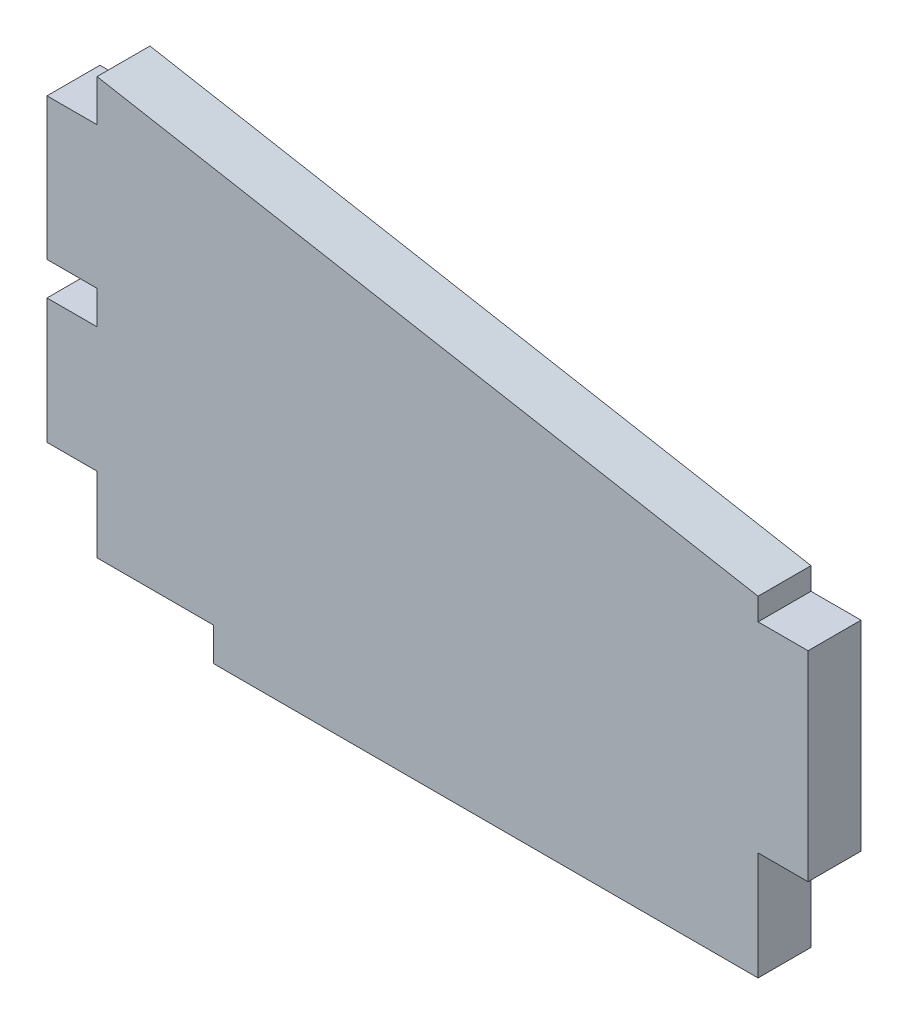
ISO-10303-21;
HEADER;
FILE_DESCRIPTION(('STEP AP214'),'2;1');
FILE_NAME('part.step','',(''),(''),'','','');
FILE_SCHEMA(('AUTOMOTIVE_DESIGN { 1 0 10303 214 1 1 1 1 }'));
ENDSEC;
DATA;
#1=APPLICATION_CONTEXT('core data for automotive mechanical design processes');
#2=APPLICATION_PROTOCOL_DEFINITION('international standard','automotive_design',2000,#1);
#3=PRODUCT_CONTEXT('',#1,'mechanical');
#4=PRODUCT('Part','Part','',(#3));
#5=PRODUCT_RELATED_PRODUCT_CATEGORY('part','',(#4));
#6=PRODUCT_DEFINITION_FORMATION('','',#4);
#7=PRODUCT_DEFINITION_CONTEXT('part definition',#1,'design');
#8=PRODUCT_DEFINITION('design','',#6,#7);
#9=PRODUCT_DEFINITION_SHAPE('','',#8);
#10=(LENGTH_UNIT() NAMED_UNIT(*) SI_UNIT(.MILLI.,.METRE.));
#11=(NAMED_UNIT(*) PLANE_ANGLE_UNIT() SI_UNIT($,.RADIAN.));
#12=(NAMED_UNIT(*) SI_UNIT($,.STERADIAN.) SOLID_ANGLE_UNIT());
#13=UNCERTAINTY_MEASURE_WITH_UNIT(LENGTH_MEASURE(1.E-05),#10,'distance_accuracy_value','');
#14=(GEOMETRIC_REPRESENTATION_CONTEXT(3) GLOBAL_UNCERTAINTY_ASSIGNED_CONTEXT((#13)) GLOBAL_UNIT_ASSIGNED_CONTEXT((#10,
#11,#12)) REPRESENTATION_CONTEXT('',''));
#15=CARTESIAN_POINT('',(0.,0.,0.));
#16=DIRECTION('',(0.,0.,1.));
#17=DIRECTION('',(1.,0.,0.));
#18=AXIS2_PLACEMENT_3D('',#15,#16,#17);
#19=CARTESIAN_POINT('',(-22.825,0.,3.175));
#20=DIRECTION('',(-1.,0.,0.));
#21=DIRECTION('',(0.,0.,1.));
#22=AXIS2_PLACEMENT_3D('',#19,#20,#21);
#23=PLANE('',#22);
#24=DIRECTION('',(0.,1.,0.));
#25=VECTOR('',#24,1.);
#26=CARTESIAN_POINT('',(-22.825,0.,0.));
#27=LINE('',#26,#25);
#28=CARTESIAN_POINT('',(-22.825,1.5,0.));
#29=VERTEX_POINT('',#28);
#30=CARTESIAN_POINT('',(-22.825,9.99999999999999,0.));
#31=VERTEX_POINT('',#30);
#32=EDGE_CURVE('E270',#29,#31,#27,.T.);
#33=ORIENTED_EDGE('',*,*,#32,.F.);
#34=DIRECTION('',(0.,0.,1.));
#35=VECTOR('',#34,1.);
#36=CARTESIAN_POINT('',(-22.825,1.5,0.));
#37=LINE('',#36,#35);
#38=CARTESIAN_POINT('',(-22.825,1.5,3.175));
#39=VERTEX_POINT('',#38);
#40=EDGE_CURVE('E197',#29,#39,#37,.T.);
#41=ORIENTED_EDGE('',*,*,#40,.T.);
#42=DIRECTION('',(0.,1.,0.));
#43=VECTOR('',#42,1.);
#44=CARTESIAN_POINT('',(-22.825,0.,3.175));
#45=LINE('',#44,#43);
#46=CARTESIAN_POINT('',(-22.825,9.99999999999999,3.175));
#47=VERTEX_POINT('',#46);
#48=EDGE_CURVE('E241',#39,#47,#45,.T.);
#49=ORIENTED_EDGE('',*,*,#48,.T.);
#50=DIRECTION('',(0.,0.,-1.));
#51=VECTOR('',#50,1.);
#52=CARTESIAN_POINT('',(-22.825,9.99999999999999,3.175));
#53=LINE('',#52,#51);
#54=EDGE_CURVE('E280',#47,#31,#53,.T.);
#55=ORIENTED_EDGE('',*,*,#54,.T.);
#56=EDGE_LOOP('',(#33,#41,#49,#55));
#57=FACE_BOUND('',#56,.T.);
#58=ADVANCED_FACE('F39',(#57),#23,.T.);
#59=CARTESIAN_POINT('',(0.,-12.5,3.175));
#60=DIRECTION('',(0.,1.,0.));
#61=DIRECTION('',(0.,0.,1.));
#62=AXIS2_PLACEMENT_3D('',#59,#60,#61);
#63=PLANE('',#62);
#64=DIRECTION('',(1.,0.,0.));
#65=VECTOR('',#64,1.);
#66=CARTESIAN_POINT('',(0.,-12.5,0.));
#67=LINE('',#66,#65);
#68=CARTESIAN_POINT('',(-19.825,-12.5,0.));
#69=VERTEX_POINT('',#68);
#70=CARTESIAN_POINT('',(-12.825,-12.5,0.));
#71=VERTEX_POINT('',#70);
#72=EDGE_CURVE('E206',#69,#71,#67,.T.);
#73=ORIENTED_EDGE('',*,*,#72,.T.);
#74=DIRECTION('',(0.,0.,1.));
#75=VECTOR('',#74,1.);
#76=CARTESIAN_POINT('',(-12.825,-12.5,-32.7111983883196));
#77=LINE('',#76,#75);
#78=CARTESIAN_POINT('',(-12.825,-12.5,3.175));
#79=VERTEX_POINT('',#78);
#80=EDGE_CURVE('E211',#71,#79,#77,.T.);
#81=ORIENTED_EDGE('',*,*,#80,.T.);
#82=DIRECTION('',(1.,0.,0.));
#83=VECTOR('',#82,1.);
#84=CARTESIAN_POINT('',(0.,-12.5,3.175));
#85=LINE('',#84,#83);
#86=CARTESIAN_POINT('',(-19.825,-12.5,3.175));
#87=VERTEX_POINT('',#86);
#88=EDGE_CURVE('E217',#87,#79,#85,.T.);
#89=ORIENTED_EDGE('',*,*,#88,.F.);
#90=DIRECTION('',(0.,0.,-1.));
#91=VECTOR('',#90,1.);
#92=CARTESIAN_POINT('',(-19.825,-12.5,3.175));
#93=LINE('',#92,#91);
#94=EDGE_CURVE('E274',#87,#69,#93,.T.);
#95=ORIENTED_EDGE('',*,*,#94,.T.);
#96=EDGE_LOOP('',(#73,#81,#89,#95));
#97=FACE_BOUND('',#96,.T.);
#98=ADVANCED_FACE('F41',(#97),#63,.F.);
#99=CARTESIAN_POINT('',(19.825,0.,3.175));
#100=DIRECTION('',(-1.,0.,0.));
#101=DIRECTION('',(0.,0.,1.));
#102=AXIS2_PLACEMENT_3D('',#99,#100,#101);
#103=PLANE('',#102);
#104=DIRECTION('',(0.,1.,0.));
#105=VECTOR('',#104,1.);
#106=CARTESIAN_POINT('',(19.825,0.,0.));
#107=LINE('',#106,#105);
#108=CARTESIAN_POINT('',(19.825,-14.5,0.));
#109=VERTEX_POINT('',#108);
#110=CARTESIAN_POINT('',(19.825,-8.,0.));
#111=VERTEX_POINT('',#110);
#112=EDGE_CURVE('E250',#109,#111,#107,.T.);
#113=ORIENTED_EDGE('',*,*,#112,.T.);
#114=DIRECTION('',(0.,0.,-1.));
#115=VECTOR('',#114,1.);
#116=CARTESIAN_POINT('',(19.825,-8.,3.175));
#117=LINE('',#116,#115);
#118=CARTESIAN_POINT('',(19.825,-8.,3.175));
#119=VERTEX_POINT('',#118);
#120=EDGE_CURVE('E11',#119,#111,#117,.T.);
#121=ORIENTED_EDGE('',*,*,#120,.F.);
#122=DIRECTION('',(0.,1.,0.));
#123=VECTOR('',#122,1.);
#124=CARTESIAN_POINT('',(19.825,0.,3.175));
#125=LINE('',#124,#123);
#126=CARTESIAN_POINT('',(19.825,-14.5,3.175));
#127=VERTEX_POINT('',#126);
#128=EDGE_CURVE('E220',#127,#119,#125,.T.);
#129=ORIENTED_EDGE('',*,*,#128,.F.);
#130=DIRECTION('',(0.,0.,1.));
#131=VECTOR('',#130,1.);
#132=CARTESIAN_POINT('',(19.825,-14.5,-32.7111983883196));
#133=LINE('',#132,#131);
#134=EDGE_CURVE('E204',#109,#127,#133,.T.);
#135=ORIENTED_EDGE('',*,*,#134,.F.);
#136=EDGE_LOOP('',(#113,#121,#129,#135));
#137=FACE_BOUND('',#136,.T.);
#138=ADVANCED_FACE('F316',(#137),#103,.F.);
#139=CARTESIAN_POINT('',(0.,-7.99999999999999,3.175));
#140=DIRECTION('',(0.,1.,0.));
#141=DIRECTION('',(-1.,0.,0.));
#142=AXIS2_PLACEMENT_3D('',#139,#140,#141);
#143=PLANE('',#142);
#144=DIRECTION('',(1.,0.,0.));
#145=VECTOR('',#144,1.);
#146=CARTESIAN_POINT('',(0.,-7.99999999999999,0.));
#147=LINE('',#146,#145);
#148=CARTESIAN_POINT('',(22.825,-8.,0.));
#149=VERTEX_POINT('',#148);
#150=EDGE_CURVE('E252',#111,#149,#147,.T.);
#151=ORIENTED_EDGE('',*,*,#150,.T.);
#152=DIRECTION('',(0.,0.,-1.));
#153=VECTOR('',#152,1.);
#154=CARTESIAN_POINT('',(22.825,-8.,3.175));
#155=LINE('',#154,#153);
#156=CARTESIAN_POINT('',(22.825,-8.,3.175));
#157=VERTEX_POINT('',#156);
#158=EDGE_CURVE('E47',#157,#149,#155,.T.);
#159=ORIENTED_EDGE('',*,*,#158,.F.);
#160=DIRECTION('',(1.,0.,0.));
#161=VECTOR('',#160,1.);
#162=CARTESIAN_POINT('',(0.,-7.99999999999999,3.175));
#163=LINE('',#162,#161);
#164=EDGE_CURVE('E223',#119,#157,#163,.T.);
#165=ORIENTED_EDGE('',*,*,#164,.F.);
#166=ORIENTED_EDGE('',*,*,#120,.T.);
#167=EDGE_LOOP('',(#151,#159,#165,#166));
#168=FACE_BOUND('',#167,.T.);
#169=ADVANCED_FACE('F314',(#168),#143,.F.);
#170=CARTESIAN_POINT('',(22.825,0.,3.175));
#171=DIRECTION('',(-1.,0.,0.));
#172=DIRECTION('',(0.,0.,1.));
#173=AXIS2_PLACEMENT_3D('',#170,#171,#172);
#174=PLANE('',#173);
#175=DIRECTION('',(0.,1.,0.));
#176=VECTOR('',#175,1.);
#177=CARTESIAN_POINT('',(22.825,0.,0.));
#178=LINE('',#177,#176);
#179=CARTESIAN_POINT('',(22.825,4.,0.));
#180=VERTEX_POINT('',#179);
#181=EDGE_CURVE('E255',#149,#180,#178,.T.);
#182=ORIENTED_EDGE('',*,*,#181,.T.);
#183=DIRECTION('',(0.,0.,-1.));
#184=VECTOR('',#183,1.);
#185=CARTESIAN_POINT('',(22.825,4.,3.175));
#186=LINE('',#185,#184);
#187=CARTESIAN_POINT('',(22.825,4.,3.175));
#188=VERTEX_POINT('',#187);
#189=EDGE_CURVE('E291',#188,#180,#186,.T.);
#190=ORIENTED_EDGE('',*,*,#189,.F.);
#191=DIRECTION('',(0.,1.,0.));
#192=VECTOR('',#191,1.);
#193=CARTESIAN_POINT('',(22.825,0.,3.175));
#194=LINE('',#193,#192);
#195=EDGE_CURVE('E226',#157,#188,#194,.T.);
#196=ORIENTED_EDGE('',*,*,#195,.F.);
#197=ORIENTED_EDGE('',*,*,#158,.T.);
#198=EDGE_LOOP('',(#182,#190,#196,#197));
#199=FACE_BOUND('',#198,.T.);
#200=ADVANCED_FACE('F297',(#199),#174,.F.);
#201=CARTESIAN_POINT('',(0.,4.,3.175));
#202=DIRECTION('',(0.,1.,0.));
#203=DIRECTION('',(0.,0.,1.));
#204=AXIS2_PLACEMENT_3D('',#201,#202,#203);
#205=PLANE('',#204);
#206=DIRECTION('',(1.,0.,0.));
#207=VECTOR('',#206,1.);
#208=CARTESIAN_POINT('',(0.,4.,0.));
#209=LINE('',#208,#207);
#210=CARTESIAN_POINT('',(19.825,4.,0.));
#211=VERTEX_POINT('',#210);
#212=EDGE_CURVE('E258',#211,#180,#209,.T.);
#213=ORIENTED_EDGE('',*,*,#212,.F.);
#214=DIRECTION('',(0.,0.,-1.));
#215=VECTOR('',#214,1.);
#216=CARTESIAN_POINT('',(19.825,4.,3.175));
#217=LINE('',#216,#215);
#218=CARTESIAN_POINT('',(19.825,4.,3.175));
#219=VERTEX_POINT('',#218);
#220=EDGE_CURVE('E289',#219,#211,#217,.T.);
#221=ORIENTED_EDGE('',*,*,#220,.F.);
#222=DIRECTION('',(1.,0.,0.));
#223=VECTOR('',#222,1.);
#224=CARTESIAN_POINT('',(0.,4.,3.175));
#225=LINE('',#224,#223);
#226=EDGE_CURVE('E228',#219,#188,#225,.T.);
#227=ORIENTED_EDGE('',*,*,#226,.T.);
#228=ORIENTED_EDGE('',*,*,#189,.T.);
#229=EDGE_LOOP('',(#213,#221,#227,#228));
#230=FACE_BOUND('',#229,.T.);
#231=ADVANCED_FACE('F306',(#230),#205,.T.);
#232=CARTESIAN_POINT('',(19.825,5.33173076923077,0.));
#233=VERTEX_POINT('',#232);
#234=EDGE_CURVE('E253',#211,#233,#107,.T.);
#235=ORIENTED_EDGE('',*,*,#234,.T.);
#236=DIRECTION('',(0.,0.,-1.));
#237=VECTOR('',#236,1.);
#238=CARTESIAN_POINT('',(19.825,5.33173076923077,3.175));
#239=LINE('',#238,#237);
#240=CARTESIAN_POINT('',(19.825,5.33173076923077,3.175));
#241=VERTEX_POINT('',#240);
#242=EDGE_CURVE('E287',#241,#233,#239,.T.);
#243=ORIENTED_EDGE('',*,*,#242,.F.);
#244=EDGE_CURVE('E224',#219,#241,#125,.T.);
#245=ORIENTED_EDGE('',*,*,#244,.F.);
#246=ORIENTED_EDGE('',*,*,#220,.T.);
#247=EDGE_LOOP('',(#235,#243,#245,#246));
#248=FACE_BOUND('',#247,.T.);
#249=ADVANCED_FACE('F358',(#248),#103,.F.);
#250=CARTESIAN_POINT('',(1.5608707733027,8.63367769388467,3.175));
#251=DIRECTION('',(0.177904642532033,0.98404773165002,0.));
#252=DIRECTION('',(-0.98404773165002,0.177904642532033,0.));
#253=AXIS2_PLACEMENT_3D('',#250,#251,#252);
#254=PLANE('',#253);
#255=DIRECTION('',(0.98404773165002,-0.177904642532033,0.));
#256=VECTOR('',#255,1.);
#257=CARTESIAN_POINT('',(1.5608707733027,8.63367769388467,0.));
#258=LINE('',#257,#256);
#259=CARTESIAN_POINT('',(-19.825,12.5,0.));
#260=VERTEX_POINT('',#259);
#261=EDGE_CURVE('E261',#260,#233,#258,.T.);
#262=ORIENTED_EDGE('',*,*,#261,.F.);
#263=DIRECTION('',(0.,0.,-1.));
#264=VECTOR('',#263,1.);
#265=CARTESIAN_POINT('',(-19.825,12.5,3.175));
#266=LINE('',#265,#264);
#267=CARTESIAN_POINT('',(-19.825,12.5,3.175));
#268=VERTEX_POINT('',#267);
#269=EDGE_CURVE('E285',#268,#260,#266,.T.);
#270=ORIENTED_EDGE('',*,*,#269,.F.);
#271=DIRECTION('',(0.98404773165002,-0.177904642532033,0.));
#272=VECTOR('',#271,1.);
#273=CARTESIAN_POINT('',(1.5608707733027,8.63367769388467,3.175));
#274=LINE('',#273,#272);
#275=EDGE_CURVE('E231',#268,#241,#274,.T.);
#276=ORIENTED_EDGE('',*,*,#275,.T.);
#277=ORIENTED_EDGE('',*,*,#242,.T.);
#278=EDGE_LOOP('',(#262,#270,#276,#277));
#279=FACE_BOUND('',#278,.T.);
#280=ADVANCED_FACE('F356',(#279),#254,.T.);
#281=CARTESIAN_POINT('',(-19.825,0.,3.175));
#282=DIRECTION('',(-1.,0.,0.));
#283=DIRECTION('',(0.,0.,1.));
#284=AXIS2_PLACEMENT_3D('',#281,#282,#283);
#285=PLANE('',#284);
#286=DIRECTION('',(0.,1.,0.));
#287=VECTOR('',#286,1.);
#288=CARTESIAN_POINT('',(-19.825,0.,0.));
#289=LINE('',#288,#287);
#290=CARTESIAN_POINT('',(-19.825,9.99999999999999,0.));
#291=VERTEX_POINT('',#290);
#292=EDGE_CURVE('E264',#291,#260,#289,.T.);
#293=ORIENTED_EDGE('',*,*,#292,.F.);
#294=DIRECTION('',(0.,0.,-1.));
#295=VECTOR('',#294,1.);
#296=CARTESIAN_POINT('',(-19.825,9.99999999999999,3.175));
#297=LINE('',#296,#295);
#298=CARTESIAN_POINT('',(-19.825,9.99999999999999,3.175));
#299=VERTEX_POINT('',#298);
#300=EDGE_CURVE('E283',#299,#291,#297,.T.);
#301=ORIENTED_EDGE('',*,*,#300,.F.);
#302=DIRECTION('',(0.,1.,0.));
#303=VECTOR('',#302,1.);
#304=CARTESIAN_POINT('',(-19.825,0.,3.175));
#305=LINE('',#304,#303);
#306=EDGE_CURVE('E234',#299,#268,#305,.T.);
#307=ORIENTED_EDGE('',*,*,#306,.T.);
#308=ORIENTED_EDGE('',*,*,#269,.T.);
#309=EDGE_LOOP('',(#293,#301,#307,#308));
#310=FACE_BOUND('',#309,.T.);
#311=ADVANCED_FACE('F351',(#310),#285,.T.);
#312=CARTESIAN_POINT('',(0.,9.99999999999999,3.175));
#313=DIRECTION('',(0.,-1.,0.));
#314=DIRECTION('',(0.,0.,-1.));
#315=AXIS2_PLACEMENT_3D('',#312,#313,#314);
#316=PLANE('',#315);
#317=DIRECTION('',(-1.,0.,0.));
#318=VECTOR('',#317,1.);
#319=CARTESIAN_POINT('',(0.,9.99999999999999,0.));
#320=LINE('',#319,#318);
#321=EDGE_CURVE('E267',#291,#31,#320,.T.);
#322=ORIENTED_EDGE('',*,*,#321,.T.);
#323=ORIENTED_EDGE('',*,*,#54,.F.);
#324=DIRECTION('',(-1.,0.,0.));
#325=VECTOR('',#324,1.);
#326=CARTESIAN_POINT('',(0.,9.99999999999999,3.175));
#327=LINE('',#326,#325);
#328=EDGE_CURVE('E237',#299,#47,#327,.T.);
#329=ORIENTED_EDGE('',*,*,#328,.F.);
#330=ORIENTED_EDGE('',*,*,#300,.T.);
#331=EDGE_LOOP('',(#322,#323,#329,#330));
#332=FACE_BOUND('',#331,.T.);
#333=ADVANCED_FACE('F377',(#332),#316,.F.);
#334=DIRECTION('',(0.,0.,1.));
#335=VECTOR('',#334,1.);
#336=CARTESIAN_POINT('',(-22.825,-0.500000000000004,0.));
#337=LINE('',#336,#335);
#338=CARTESIAN_POINT('',(-22.825,-0.500000000000004,0.));
#339=VERTEX_POINT('',#338);
#340=CARTESIAN_POINT('',(-22.825,-0.500000000000004,3.175));
#341=VERTEX_POINT('',#340);
#342=EDGE_CURVE('E195',#339,#341,#337,.T.);
#343=ORIENTED_EDGE('',*,*,#342,.F.);
#344=CARTESIAN_POINT('',(-22.825,-8.,0.));
#345=VERTEX_POINT('',#344);
#346=EDGE_CURVE('E185',#345,#339,#27,.T.);
#347=ORIENTED_EDGE('',*,*,#346,.F.);
#348=DIRECTION('',(0.,0.,-1.));
#349=VECTOR('',#348,1.);
#350=CARTESIAN_POINT('',(-22.825,-8.,3.175));
#351=LINE('',#350,#349);
#352=CARTESIAN_POINT('',(-22.825,-8.,3.175));
#353=VERTEX_POINT('',#352);
#354=EDGE_CURVE('E278',#353,#345,#351,.T.);
#355=ORIENTED_EDGE('',*,*,#354,.F.);
#356=EDGE_CURVE('E242',#353,#341,#45,.T.);
#357=ORIENTED_EDGE('',*,*,#356,.T.);
#358=EDGE_LOOP('',(#343,#347,#355,#357));
#359=FACE_BOUND('',#358,.T.);
#360=ADVANCED_FACE('F340',(#359),#23,.T.);
#361=CARTESIAN_POINT('',(0.,-7.99999999999999,3.175));
#362=DIRECTION('',(0.,-1.,0.));
#363=DIRECTION('',(1.,0.,0.));
#364=AXIS2_PLACEMENT_3D('',#361,#362,#363);
#365=PLANE('',#364);
#366=DIRECTION('',(-1.,0.,0.));
#367=VECTOR('',#366,1.);
#368=CARTESIAN_POINT('',(0.,-7.99999999999999,0.));
#369=LINE('',#368,#367);
#370=CARTESIAN_POINT('',(-19.825,-8.,0.));
#371=VERTEX_POINT('',#370);
#372=EDGE_CURVE('E272',#371,#345,#369,.T.);
#373=ORIENTED_EDGE('',*,*,#372,.F.);
#374=DIRECTION('',(0.,0.,-1.));
#375=VECTOR('',#374,1.);
#376=CARTESIAN_POINT('',(-19.825,-8.,3.175));
#377=LINE('',#376,#375);
#378=CARTESIAN_POINT('',(-19.825,-8.,3.175));
#379=VERTEX_POINT('',#378);
#380=EDGE_CURVE('E276',#379,#371,#377,.T.);
#381=ORIENTED_EDGE('',*,*,#380,.F.);
#382=DIRECTION('',(-1.,0.,0.));
#383=VECTOR('',#382,1.);
#384=CARTESIAN_POINT('',(0.,-7.99999999999999,3.175));
#385=LINE('',#384,#383);
#386=EDGE_CURVE('E245',#379,#353,#385,.T.);
#387=ORIENTED_EDGE('',*,*,#386,.T.);
#388=ORIENTED_EDGE('',*,*,#354,.T.);
#389=EDGE_LOOP('',(#373,#381,#387,#388));
#390=FACE_BOUND('',#389,.T.);
#391=ADVANCED_FACE('F337',(#390),#365,.T.);
#392=EDGE_CURVE('E221',#69,#371,#289,.T.);
#393=ORIENTED_EDGE('',*,*,#392,.F.);
#394=ORIENTED_EDGE('',*,*,#94,.F.);
#395=EDGE_CURVE('E238',#87,#379,#305,.T.);
#396=ORIENTED_EDGE('',*,*,#395,.T.);
#397=ORIENTED_EDGE('',*,*,#380,.T.);
#398=EDGE_LOOP('',(#393,#394,#396,#397));
#399=FACE_BOUND('',#398,.T.);
#400=ADVANCED_FACE('F334',(#399),#285,.T.);
#401=CARTESIAN_POINT('',(0.,0.,3.175));
#402=DIRECTION('',(0.,0.,1.));
#403=DIRECTION('',(1.,0.,0.));
#404=AXIS2_PLACEMENT_3D('',#401,#402,#403);
#405=PLANE('',#404);
#406=DIRECTION('',(1.,0.,0.));
#407=VECTOR('',#406,1.);
#408=CARTESIAN_POINT('',(-22.825,-0.500000000000004,3.175));
#409=LINE('',#408,#407);
#410=CARTESIAN_POINT('',(-19.825,-0.500000000000004,3.175));
#411=VERTEX_POINT('',#410);
#412=EDGE_CURVE('E178',#341,#411,#409,.T.);
#413=ORIENTED_EDGE('',*,*,#412,.F.);
#414=ORIENTED_EDGE('',*,*,#356,.F.);
#415=ORIENTED_EDGE('',*,*,#386,.F.);
#416=ORIENTED_EDGE('',*,*,#395,.F.);
#417=ORIENTED_EDGE('',*,*,#88,.T.);
#418=DIRECTION('',(0.,-1.,0.));
#419=VECTOR('',#418,1.);
#420=CARTESIAN_POINT('',(-12.825,-12.5,3.175));
#421=LINE('',#420,#419);
#422=CARTESIAN_POINT('',(-12.825,-14.5,3.175));
#423=VERTEX_POINT('',#422);
#424=EDGE_CURVE('E62',#79,#423,#421,.T.);
#425=ORIENTED_EDGE('',*,*,#424,.T.);
#426=DIRECTION('',(1.,0.,0.));
#427=VECTOR('',#426,1.);
#428=CARTESIAN_POINT('',(19.825,-14.5,3.175));
#429=LINE('',#428,#427);
#430=EDGE_CURVE('E208',#423,#127,#429,.T.);
#431=ORIENTED_EDGE('',*,*,#430,.T.);
#432=ORIENTED_EDGE('',*,*,#128,.T.);
#433=ORIENTED_EDGE('',*,*,#164,.T.);
#434=ORIENTED_EDGE('',*,*,#195,.T.);
#435=ORIENTED_EDGE('',*,*,#226,.F.);
#436=ORIENTED_EDGE('',*,*,#244,.T.);
#437=ORIENTED_EDGE('',*,*,#275,.F.);
#438=ORIENTED_EDGE('',*,*,#306,.F.);
#439=ORIENTED_EDGE('',*,*,#328,.T.);
#440=ORIENTED_EDGE('',*,*,#48,.F.);
#441=DIRECTION('',(1.,0.,0.));
#442=VECTOR('',#441,1.);
#443=CARTESIAN_POINT('',(-22.825,1.5,3.175));
#444=LINE('',#443,#442);
#445=CARTESIAN_POINT('',(-19.825,1.5,3.175));
#446=VERTEX_POINT('',#445);
#447=EDGE_CURVE('E186',#39,#446,#444,.T.);
#448=ORIENTED_EDGE('',*,*,#447,.T.);
#449=DIRECTION('',(0.,-1.,0.));
#450=VECTOR('',#449,1.);
#451=CARTESIAN_POINT('',(-19.825,1.5,3.175));
#452=LINE('',#451,#450);
#453=EDGE_CURVE('E189',#446,#411,#452,.T.);
#454=ORIENTED_EDGE('',*,*,#453,.T.);
#455=EDGE_LOOP('',(#413,#414,#415,#416,#417,#425,#431,#432,#433,#434,#435,#436,#437,#438,#439,
#440,#448,#454));
#456=FACE_BOUND('',#455,.T.);
#457=ADVANCED_FACE('F310',(#456),#405,.T.);
#458=CARTESIAN_POINT('',(0.,0.,0.));
#459=DIRECTION('',(0.,0.,1.));
#460=DIRECTION('',(1.,0.,0.));
#461=AXIS2_PLACEMENT_3D('',#458,#459,#460);
#462=PLANE('',#461);
#463=ORIENTED_EDGE('',*,*,#346,.T.);
#464=DIRECTION('',(1.,0.,0.));
#465=VECTOR('',#464,1.);
#466=CARTESIAN_POINT('',(-22.825,-0.500000000000004,0.));
#467=LINE('',#466,#465);
#468=CARTESIAN_POINT('',(-19.825,-0.500000000000004,0.));
#469=VERTEX_POINT('',#468);
#470=EDGE_CURVE('E172',#339,#469,#467,.T.);
#471=ORIENTED_EDGE('',*,*,#470,.T.);
#472=DIRECTION('',(0.,-1.,0.));
#473=VECTOR('',#472,1.);
#474=CARTESIAN_POINT('',(-19.825,1.5,0.));
#475=LINE('',#474,#473);
#476=CARTESIAN_POINT('',(-19.825,1.5,0.));
#477=VERTEX_POINT('',#476);
#478=EDGE_CURVE('E163',#477,#469,#475,.T.);
#479=ORIENTED_EDGE('',*,*,#478,.F.);
#480=DIRECTION('',(1.,0.,0.));
#481=VECTOR('',#480,1.);
#482=CARTESIAN_POINT('',(-22.825,1.5,0.));
#483=LINE('',#482,#481);
#484=EDGE_CURVE('E171',#29,#477,#483,.T.);
#485=ORIENTED_EDGE('',*,*,#484,.F.);
#486=ORIENTED_EDGE('',*,*,#32,.T.);
#487=ORIENTED_EDGE('',*,*,#321,.F.);
#488=ORIENTED_EDGE('',*,*,#292,.T.);
#489=ORIENTED_EDGE('',*,*,#261,.T.);
#490=ORIENTED_EDGE('',*,*,#234,.F.);
#491=ORIENTED_EDGE('',*,*,#212,.T.);
#492=ORIENTED_EDGE('',*,*,#181,.F.);
#493=ORIENTED_EDGE('',*,*,#150,.F.);
#494=ORIENTED_EDGE('',*,*,#112,.F.);
#495=DIRECTION('',(-1.,0.,0.));
#496=VECTOR('',#495,1.);
#497=CARTESIAN_POINT('',(19.825,-14.5,0.));
#498=LINE('',#497,#496);
#499=CARTESIAN_POINT('',(-12.825,-14.5,0.));
#500=VERTEX_POINT('',#499);
#501=EDGE_CURVE('E203',#109,#500,#498,.T.);
#502=ORIENTED_EDGE('',*,*,#501,.T.);
#503=DIRECTION('',(0.,1.,0.));
#504=VECTOR('',#503,1.);
#505=CARTESIAN_POINT('',(-12.825,-12.5,0.));
#506=LINE('',#505,#504);
#507=EDGE_CURVE('E201',#500,#71,#506,.T.);
#508=ORIENTED_EDGE('',*,*,#507,.T.);
#509=ORIENTED_EDGE('',*,*,#72,.F.);
#510=ORIENTED_EDGE('',*,*,#392,.T.);
#511=ORIENTED_EDGE('',*,*,#372,.T.);
#512=EDGE_LOOP('',(#463,#471,#479,#485,#486,#487,#488,#489,#490,#491,#492,#493,#494,#502,#508,
#509,#510,#511));
#513=FACE_BOUND('',#512,.T.);
#514=ADVANCED_FACE('F182',(#513),#462,.F.);
#515=CARTESIAN_POINT('',(19.825,-14.5,-32.7111983883196));
#516=DIRECTION('',(0.,-1.,0.));
#517=DIRECTION('',(1.,0.,0.));
#518=AXIS2_PLACEMENT_3D('',#515,#516,#517);
#519=PLANE('',#518);
#520=ORIENTED_EDGE('',*,*,#501,.F.);
#521=ORIENTED_EDGE('',*,*,#134,.T.);
#522=ORIENTED_EDGE('',*,*,#430,.F.);
#523=DIRECTION('',(0.,0.,1.));
#524=VECTOR('',#523,1.);
#525=CARTESIAN_POINT('',(-12.825,-14.5,-32.7111983883196));
#526=LINE('',#525,#524);
#527=EDGE_CURVE('E214',#500,#423,#526,.T.);
#528=ORIENTED_EDGE('',*,*,#527,.F.);
#529=EDGE_LOOP('',(#520,#521,#522,#528));
#530=FACE_BOUND('',#529,.T.);
#531=ADVANCED_FACE('F322',(#530),#519,.T.);
#532=CARTESIAN_POINT('',(-12.825,-12.5,-32.7111983883196));
#533=DIRECTION('',(-1.,0.,0.));
#534=DIRECTION('',(0.,0.,1.));
#535=AXIS2_PLACEMENT_3D('',#532,#533,#534);
#536=PLANE('',#535);
#537=ORIENTED_EDGE('',*,*,#507,.F.);
#538=ORIENTED_EDGE('',*,*,#527,.T.);
#539=ORIENTED_EDGE('',*,*,#424,.F.);
#540=ORIENTED_EDGE('',*,*,#80,.F.);
#541=EDGE_LOOP('',(#537,#538,#539,#540));
#542=FACE_BOUND('',#541,.T.);
#543=ADVANCED_FACE('F324',(#542),#536,.T.);
#544=CARTESIAN_POINT('',(-22.825,-0.500000000000004,0.));
#545=DIRECTION('',(0.,-1.,0.));
#546=DIRECTION('',(0.,0.,-1.));
#547=AXIS2_PLACEMENT_3D('',#544,#545,#546);
#548=PLANE('',#547);
#549=ORIENTED_EDGE('',*,*,#412,.T.);
#550=DIRECTION('',(0.,0.,1.));
#551=VECTOR('',#550,1.);
#552=CARTESIAN_POINT('',(-19.825,-0.500000000000004,0.));
#553=LINE('',#552,#551);
#554=EDGE_CURVE('E166',#469,#411,#553,.T.);
#555=ORIENTED_EDGE('',*,*,#554,.F.);
#556=ORIENTED_EDGE('',*,*,#470,.F.);
#557=ORIENTED_EDGE('',*,*,#342,.T.);
#558=EDGE_LOOP('',(#549,#555,#556,#557));
#559=FACE_BOUND('',#558,.T.);
#560=ADVANCED_FACE('F175',(#559),#548,.F.);
#561=CARTESIAN_POINT('',(-22.825,1.5,0.));
#562=DIRECTION('',(0.,-1.,0.));
#563=DIRECTION('',(0.,0.,-1.));
#564=AXIS2_PLACEMENT_3D('',#561,#562,#563);
#565=PLANE('',#564);
#566=ORIENTED_EDGE('',*,*,#447,.F.);
#567=ORIENTED_EDGE('',*,*,#40,.F.);
#568=ORIENTED_EDGE('',*,*,#484,.T.);
#569=DIRECTION('',(0.,0.,1.));
#570=VECTOR('',#569,1.);
#571=CARTESIAN_POINT('',(-19.825,1.5,0.));
#572=LINE('',#571,#570);
#573=EDGE_CURVE('E54',#477,#446,#572,.T.);
#574=ORIENTED_EDGE('',*,*,#573,.T.);
#575=EDGE_LOOP('',(#566,#567,#568,#574));
#576=FACE_BOUND('',#575,.T.);
#577=ADVANCED_FACE('F343',(#576),#565,.T.);
#578=CARTESIAN_POINT('',(-19.825,1.5,0.));
#579=DIRECTION('',(-1.,0.,0.));
#580=DIRECTION('',(0.,0.,1.));
#581=AXIS2_PLACEMENT_3D('',#578,#579,#580);
#582=PLANE('',#581);
#583=ORIENTED_EDGE('',*,*,#453,.F.);
#584=ORIENTED_EDGE('',*,*,#573,.F.);
#585=ORIENTED_EDGE('',*,*,#478,.T.);
#586=ORIENTED_EDGE('',*,*,#554,.T.);
#587=EDGE_LOOP('',(#583,#584,#585,#586));
#588=FACE_BOUND('',#587,.T.);
#589=ADVANCED_FACE('F165',(#588),#582,.T.);
#590=CLOSED_SHELL('',(#58,#98,#138,#169,#200,#231,#249,#280,#311,#333,#360,#391,#400,#457,#514,
#531,#543,#560,#577,#589));
#591=MANIFOLD_SOLID_BREP('B2',#590);
#592=ADVANCED_BREP_SHAPE_REPRESENTATION('',(#18,#591),#14);
#593=SHAPE_DEFINITION_REPRESENTATION(#9,#592);
ENDSEC;
END-ISO-10303-21;
